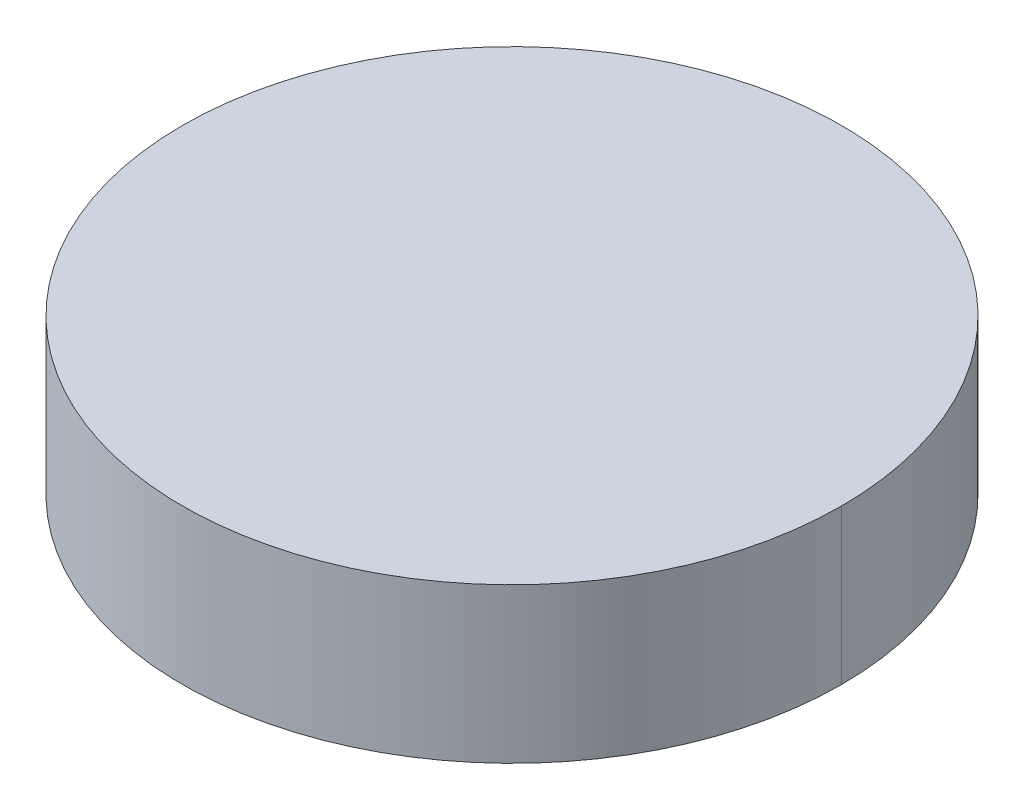
ISO-10303-21;
HEADER;
FILE_DESCRIPTION(('STEP AP214'),'2;1');
FILE_NAME('part.step','',(''),(''),'','','');
FILE_SCHEMA(('AUTOMOTIVE_DESIGN { 1 0 10303 214 1 1 1 1 }'));
ENDSEC;
DATA;
#1=APPLICATION_CONTEXT('core data for automotive mechanical design processes');
#2=APPLICATION_PROTOCOL_DEFINITION('international standard','automotive_design',2000,#1);
#3=PRODUCT_CONTEXT('',#1,'mechanical');
#4=PRODUCT('Part','Part','',(#3));
#5=PRODUCT_RELATED_PRODUCT_CATEGORY('part','',(#4));
#6=PRODUCT_DEFINITION_FORMATION('','',#4);
#7=PRODUCT_DEFINITION_CONTEXT('part definition',#1,'design');
#8=PRODUCT_DEFINITION('design','',#6,#7);
#9=PRODUCT_DEFINITION_SHAPE('','',#8);
#10=(LENGTH_UNIT() NAMED_UNIT(*) SI_UNIT(.MILLI.,.METRE.));
#11=(NAMED_UNIT(*) PLANE_ANGLE_UNIT() SI_UNIT($,.RADIAN.));
#12=(NAMED_UNIT(*) SI_UNIT($,.STERADIAN.) SOLID_ANGLE_UNIT());
#13=UNCERTAINTY_MEASURE_WITH_UNIT(LENGTH_MEASURE(1.E-05),#10,'distance_accuracy_value','');
#14=(GEOMETRIC_REPRESENTATION_CONTEXT(3) GLOBAL_UNCERTAINTY_ASSIGNED_CONTEXT((#13)) GLOBAL_UNIT_ASSIGNED_CONTEXT((#10,
#11,#12)) REPRESENTATION_CONTEXT('',''));
#15=CARTESIAN_POINT('',(0.,0.,0.));
#16=DIRECTION('',(0.,0.,1.));
#17=DIRECTION('',(1.,0.,0.));
#18=AXIS2_PLACEMENT_3D('',#15,#16,#17);
#19=CARTESIAN_POINT('',(-2.528506316936,1.2,-6.478482621));
#20=DIRECTION('',(0.,-1.,0.));
#21=DIRECTION('',(1.,0.,0.));
#22=AXIS2_PLACEMENT_3D('',#19,#20,#21);
#23=CYLINDRICAL_SURFACE('',#22,0.213095512722671);
#24=CARTESIAN_POINT('',(-2.528506316936,1.2,-6.478482621));
#25=DIRECTION('',(0.,1.,0.));
#26=DIRECTION('',(-1.,0.,0.));
#27=AXIS2_PLACEMENT_3D('',#24,#25,#26);
#28=CIRCLE('',#27,0.213095512722671);
#29=CARTESIAN_POINT('',(-2.741601829659,1.2,-6.478482621));
#30=VERTEX_POINT('',#29);
#31=CARTESIAN_POINT('',(-2.315410804213,1.2,-6.478482621));
#32=VERTEX_POINT('',#31);
#33=EDGE_CURVE('E11',#30,#32,#28,.T.);
#34=ORIENTED_EDGE('',*,*,#33,.F.);
#35=DIRECTION('',(0.,-1.,0.));
#36=VECTOR('',#35,1.);
#37=CARTESIAN_POINT('',(-2.741601829659,1.2,-6.478482621));
#38=LINE('',#37,#36);
#39=CARTESIAN_POINT('',(-2.741601829659,1.1,-6.478482621));
#40=VERTEX_POINT('',#39);
#41=EDGE_CURVE('E24',#30,#40,#38,.T.);
#42=ORIENTED_EDGE('',*,*,#41,.T.);
#43=CARTESIAN_POINT('',(-2.528506316936,1.1,-6.478482621));
#44=DIRECTION('',(0.,1.,0.));
#45=DIRECTION('',(-1.,0.,0.));
#46=AXIS2_PLACEMENT_3D('',#43,#44,#45);
#47=CIRCLE('',#46,0.213095512722671);
#48=CARTESIAN_POINT('',(-2.315410804213,1.1,-6.478482621));
#49=VERTEX_POINT('',#48);
#50=EDGE_CURVE('E39',#40,#49,#47,.T.);
#51=ORIENTED_EDGE('',*,*,#50,.T.);
#52=DIRECTION('',(0.,-1.,0.));
#53=VECTOR('',#52,1.);
#54=CARTESIAN_POINT('',(-2.315410804213,1.2,-6.478482621));
#55=LINE('',#54,#53);
#56=EDGE_CURVE('E41',#32,#49,#55,.T.);
#57=ORIENTED_EDGE('',*,*,#56,.F.);
#58=EDGE_LOOP('',(#34,#42,#51,#57));
#59=FACE_BOUND('',#58,.T.);
#60=ADVANCED_FACE('F17',(#59),#23,.T.);
#61=CARTESIAN_POINT('',(-2.528506316936,1.2,-6.478482621));
#62=DIRECTION('',(0.,-1.,0.));
#63=DIRECTION('',(1.,0.,0.));
#64=AXIS2_PLACEMENT_3D('',#61,#62,#63);
#65=CYLINDRICAL_SURFACE('',#64,0.213095512722671);
#66=ORIENTED_EDGE('',*,*,#41,.F.);
#67=CARTESIAN_POINT('',(-2.528506316936,1.2,-6.478482621));
#68=DIRECTION('',(0.,1.,0.));
#69=DIRECTION('',(-1.,0.,0.));
#70=AXIS2_PLACEMENT_3D('',#67,#68,#69);
#71=CIRCLE('',#70,0.213095512722671);
#72=EDGE_CURVE('E50',#32,#30,#71,.T.);
#73=ORIENTED_EDGE('',*,*,#72,.F.);
#74=ORIENTED_EDGE('',*,*,#56,.T.);
#75=CARTESIAN_POINT('',(-2.528506316936,1.1,-6.478482621));
#76=DIRECTION('',(0.,1.,0.));
#77=DIRECTION('',(-1.,0.,0.));
#78=AXIS2_PLACEMENT_3D('',#75,#76,#77);
#79=CIRCLE('',#78,0.213095512722671);
#80=EDGE_CURVE('E49',#49,#40,#79,.T.);
#81=ORIENTED_EDGE('',*,*,#80,.T.);
#82=EDGE_LOOP('',(#66,#73,#74,#81));
#83=FACE_BOUND('',#82,.T.);
#84=ADVANCED_FACE('F48',(#83),#65,.T.);
#85=CARTESIAN_POINT('',(-2.528506316936,1.2,-6.478482621));
#86=DIRECTION('',(0.,1.,0.));
#87=DIRECTION('',(-1.,0.,0.));
#88=AXIS2_PLACEMENT_3D('',#85,#86,#87);
#89=PLANE('',#88);
#90=ORIENTED_EDGE('',*,*,#72,.T.);
#91=ORIENTED_EDGE('',*,*,#33,.T.);
#92=EDGE_LOOP('',(#90,#91));
#93=FACE_BOUND('',#92,.T.);
#94=ADVANCED_FACE('F55',(#93),#89,.T.);
#95=CARTESIAN_POINT('',(-2.528506316936,1.1,-6.478482621));
#96=DIRECTION('',(0.,1.,0.));
#97=DIRECTION('',(-1.,0.,0.));
#98=AXIS2_PLACEMENT_3D('',#95,#96,#97);
#99=PLANE('',#98);
#100=ORIENTED_EDGE('',*,*,#80,.F.);
#101=ORIENTED_EDGE('',*,*,#50,.F.);
#102=EDGE_LOOP('',(#100,#101));
#103=FACE_BOUND('',#102,.T.);
#104=ADVANCED_FACE('F52',(#103),#99,.F.);
#105=CLOSED_SHELL('',(#60,#84,#94,#104));
#106=MANIFOLD_SOLID_BREP('B1',#105);
#107=ADVANCED_BREP_SHAPE_REPRESENTATION('',(#18,#106),#14);
#108=SHAPE_DEFINITION_REPRESENTATION(#9,#107);
ENDSEC;
END-ISO-10303-21;
